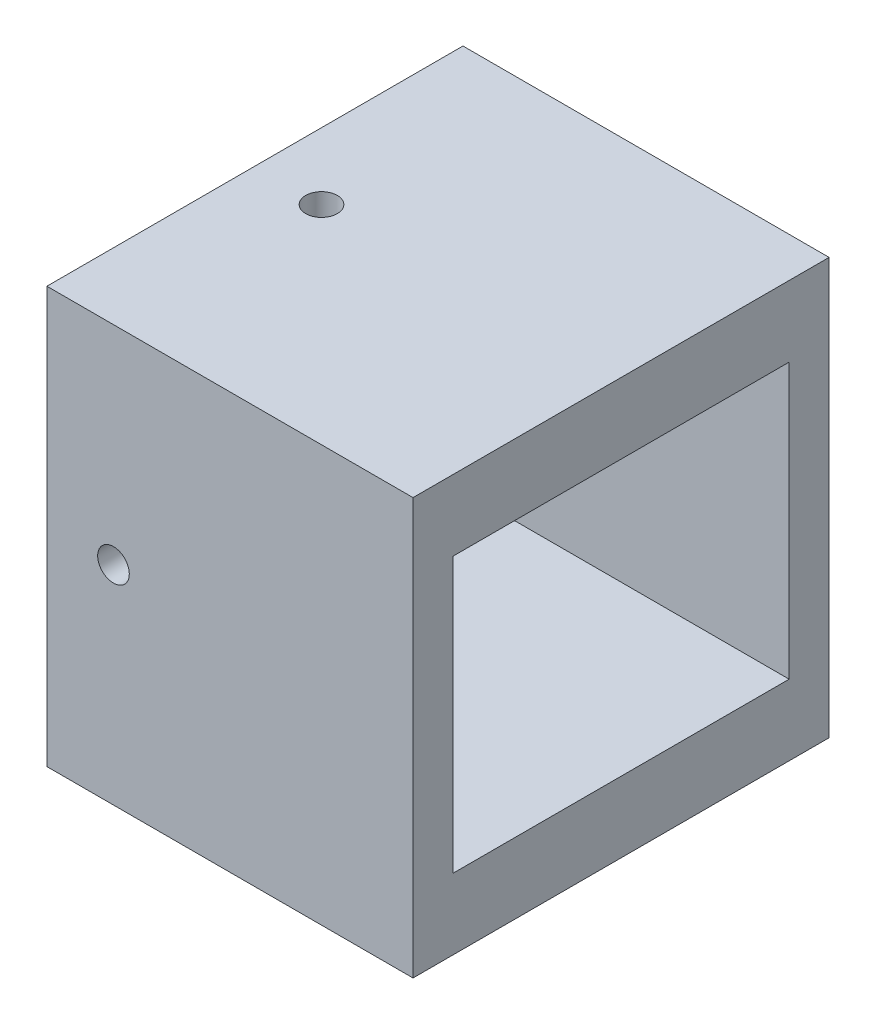
ISO-10303-21;
HEADER;
FILE_DESCRIPTION(('STEP AP214'),'2;1');
FILE_NAME('part.step','',(''),(''),'','','');
FILE_SCHEMA(('AUTOMOTIVE_DESIGN { 1 0 10303 214 1 1 1 1 }'));
ENDSEC;
DATA;
#1=APPLICATION_CONTEXT('core data for automotive mechanical design processes');
#2=APPLICATION_PROTOCOL_DEFINITION('international standard','automotive_design',2000,#1);
#3=PRODUCT_CONTEXT('',#1,'mechanical');
#4=PRODUCT('Part','Part','',(#3));
#5=PRODUCT_RELATED_PRODUCT_CATEGORY('part','',(#4));
#6=PRODUCT_DEFINITION_FORMATION('','',#4);
#7=PRODUCT_DEFINITION_CONTEXT('part definition',#1,'design');
#8=PRODUCT_DEFINITION('design','',#6,#7);
#9=PRODUCT_DEFINITION_SHAPE('','',#8);
#10=(LENGTH_UNIT() NAMED_UNIT(*) SI_UNIT(.MILLI.,.METRE.));
#11=(NAMED_UNIT(*) PLANE_ANGLE_UNIT() SI_UNIT($,.RADIAN.));
#12=(NAMED_UNIT(*) SI_UNIT($,.STERADIAN.) SOLID_ANGLE_UNIT());
#13=UNCERTAINTY_MEASURE_WITH_UNIT(LENGTH_MEASURE(1.E-05),#10,'distance_accuracy_value','');
#14=(GEOMETRIC_REPRESENTATION_CONTEXT(3) GLOBAL_UNCERTAINTY_ASSIGNED_CONTEXT((#13)) GLOBAL_UNIT_ASSIGNED_CONTEXT((#10,
#11,#12)) REPRESENTATION_CONTEXT('',''));
#15=CARTESIAN_POINT('',(0.,0.,0.));
#16=DIRECTION('',(0.,0.,1.));
#17=DIRECTION('',(1.,0.,0.));
#18=AXIS2_PLACEMENT_3D('',#15,#16,#17);
#19=CARTESIAN_POINT('',(20.,0.,0.));
#20=DIRECTION('',(1.,0.,0.));
#21=DIRECTION('',(0.,0.,-1.));
#22=AXIS2_PLACEMENT_3D('',#19,#20,#21);
#23=PLANE('',#22);
#24=DIRECTION('',(0.,1.,0.));
#25=VECTOR('',#24,1.);
#26=CARTESIAN_POINT('',(20.,-12.5,-12.5));
#27=LINE('',#26,#25);
#28=CARTESIAN_POINT('',(20.,-12.5,-12.5));
#29=VERTEX_POINT('',#28);
#30=CARTESIAN_POINT('',(20.,12.5,-12.5));
#31=VERTEX_POINT('',#30);
#32=EDGE_CURVE('E188',#29,#31,#27,.T.);
#33=ORIENTED_EDGE('',*,*,#32,.T.);
#34=DIRECTION('',(0.,0.,1.));
#35=VECTOR('',#34,1.);
#36=CARTESIAN_POINT('',(20.,12.5,-12.5));
#37=LINE('',#36,#35);
#38=CARTESIAN_POINT('',(20.,12.5,12.5));
#39=VERTEX_POINT('',#38);
#40=EDGE_CURVE('E136',#31,#39,#37,.T.);
#41=ORIENTED_EDGE('',*,*,#40,.T.);
#42=DIRECTION('',(0.,1.,0.));
#43=VECTOR('',#42,1.);
#44=CARTESIAN_POINT('',(20.,-12.5,12.5));
#45=LINE('',#44,#43);
#46=CARTESIAN_POINT('',(20.,-12.5,12.5));
#47=VERTEX_POINT('',#46);
#48=EDGE_CURVE('E191',#47,#39,#45,.T.);
#49=ORIENTED_EDGE('',*,*,#48,.F.);
#50=DIRECTION('',(0.,0.,1.));
#51=VECTOR('',#50,1.);
#52=CARTESIAN_POINT('',(20.,-12.5,-12.5));
#53=LINE('',#52,#51);
#54=EDGE_CURVE('E194',#29,#47,#53,.T.);
#55=ORIENTED_EDGE('',*,*,#54,.F.);
#56=EDGE_LOOP('',(#33,#41,#49,#55));
#57=FACE_BOUND('',#56,.T.);
#58=DIRECTION('',(0.,0.,1.));
#59=VECTOR('',#58,1.);
#60=CARTESIAN_POINT('',(20.,8.25,-10.1));
#61=LINE('',#60,#59);
#62=CARTESIAN_POINT('',(20.,8.25,-10.1));
#63=VERTEX_POINT('',#62);
#64=CARTESIAN_POINT('',(20.,8.25,10.1));
#65=VERTEX_POINT('',#64);
#66=EDGE_CURVE('E162',#63,#65,#61,.T.);
#67=ORIENTED_EDGE('',*,*,#66,.F.);
#68=DIRECTION('',(0.,1.,0.));
#69=VECTOR('',#68,1.);
#70=CARTESIAN_POINT('',(20.,-8.25,-10.1));
#71=LINE('',#70,#69);
#72=CARTESIAN_POINT('',(20.,-8.25,-10.1));
#73=VERTEX_POINT('',#72);
#74=EDGE_CURVE('E160',#73,#63,#71,.T.);
#75=ORIENTED_EDGE('',*,*,#74,.F.);
#76=DIRECTION('',(0.,0.,1.));
#77=VECTOR('',#76,1.);
#78=CARTESIAN_POINT('',(20.,-8.25,-10.1));
#79=LINE('',#78,#77);
#80=CARTESIAN_POINT('',(20.,-8.25,10.1));
#81=VERTEX_POINT('',#80);
#82=EDGE_CURVE('E166',#73,#81,#79,.T.);
#83=ORIENTED_EDGE('',*,*,#82,.T.);
#84=DIRECTION('',(0.,1.,0.));
#85=VECTOR('',#84,1.);
#86=CARTESIAN_POINT('',(20.,-8.25,10.1));
#87=LINE('',#86,#85);
#88=EDGE_CURVE('E80',#81,#65,#87,.T.);
#89=ORIENTED_EDGE('',*,*,#88,.T.);
#90=EDGE_LOOP('',(#67,#75,#83,#89));
#91=FACE_BOUND('',#90,.T.);
#92=ADVANCED_FACE('F63',(#57,#91),#23,.T.);
#93=CARTESIAN_POINT('',(20.,-12.5,-12.5));
#94=DIRECTION('',(0.,0.,1.));
#95=DIRECTION('',(1.,0.,0.));
#96=AXIS2_PLACEMENT_3D('',#93,#94,#95);
#97=PLANE('',#96);
#98=CARTESIAN_POINT('',(2.,0.,-12.5));
#99=DIRECTION('',(0.,0.,-1.));
#100=DIRECTION('',(-1.,0.,0.));
#101=AXIS2_PLACEMENT_3D('',#98,#99,#100);
#102=CIRCLE('',#101,0.95);
#103=CARTESIAN_POINT('',(1.05,0.,-12.5));
#104=VERTEX_POINT('',#103);
#105=EDGE_CURVE('E202',#104,#104,#102,.T.);
#106=ORIENTED_EDGE('',*,*,#105,.F.);
#107=EDGE_LOOP('',(#106));
#108=FACE_BOUND('',#107,.T.);
#109=DIRECTION('',(-1.,0.,0.));
#110=VECTOR('',#109,1.);
#111=CARTESIAN_POINT('',(20.,-12.5,-12.5));
#112=LINE('',#111,#110);
#113=CARTESIAN_POINT('',(-2.,-12.5,-12.5));
#114=VERTEX_POINT('',#113);
#115=EDGE_CURVE('E88',#29,#114,#112,.T.);
#116=ORIENTED_EDGE('',*,*,#115,.T.);
#117=DIRECTION('',(0.,1.,0.));
#118=VECTOR('',#117,1.);
#119=CARTESIAN_POINT('',(-2.,-12.5,-12.5));
#120=LINE('',#119,#118);
#121=CARTESIAN_POINT('',(-2.,12.5,-12.5));
#122=VERTEX_POINT('',#121);
#123=EDGE_CURVE('E145',#114,#122,#120,.T.);
#124=ORIENTED_EDGE('',*,*,#123,.T.);
#125=DIRECTION('',(-1.,0.,0.));
#126=VECTOR('',#125,1.);
#127=CARTESIAN_POINT('',(20.,12.5,-12.5));
#128=LINE('',#127,#126);
#129=EDGE_CURVE('E12',#31,#122,#128,.T.);
#130=ORIENTED_EDGE('',*,*,#129,.F.);
#131=ORIENTED_EDGE('',*,*,#32,.F.);
#132=EDGE_LOOP('',(#116,#124,#130,#131));
#133=FACE_BOUND('',#132,.T.);
#134=ADVANCED_FACE('F65',(#108,#133),#97,.F.);
#135=CARTESIAN_POINT('',(20.,12.5,-12.5));
#136=DIRECTION('',(0.,-1.,0.));
#137=DIRECTION('',(0.,0.,-1.));
#138=AXIS2_PLACEMENT_3D('',#135,#136,#137);
#139=PLANE('',#138);
#140=CARTESIAN_POINT('',(2.,12.5,0.));
#141=DIRECTION('',(0.,1.,0.));
#142=DIRECTION('',(0.,0.,1.));
#143=AXIS2_PLACEMENT_3D('',#140,#141,#142);
#144=CIRCLE('',#143,0.95);
#145=CARTESIAN_POINT('',(2.,12.5,0.950000000000002));
#146=VERTEX_POINT('',#145);
#147=EDGE_CURVE('E214',#146,#146,#144,.T.);
#148=ORIENTED_EDGE('',*,*,#147,.F.);
#149=EDGE_LOOP('',(#148));
#150=FACE_BOUND('',#149,.T.);
#151=ORIENTED_EDGE('',*,*,#129,.T.);
#152=DIRECTION('',(0.,0.,1.));
#153=VECTOR('',#152,1.);
#154=CARTESIAN_POINT('',(-2.,12.5,-12.5));
#155=LINE('',#154,#153);
#156=CARTESIAN_POINT('',(-2.,12.5,12.5));
#157=VERTEX_POINT('',#156);
#158=EDGE_CURVE('E135',#122,#157,#155,.T.);
#159=ORIENTED_EDGE('',*,*,#158,.T.);
#160=DIRECTION('',(-1.,0.,0.));
#161=VECTOR('',#160,1.);
#162=CARTESIAN_POINT('',(20.,12.5,12.5));
#163=LINE('',#162,#161);
#164=EDGE_CURVE('E72',#39,#157,#163,.T.);
#165=ORIENTED_EDGE('',*,*,#164,.F.);
#166=ORIENTED_EDGE('',*,*,#40,.F.);
#167=EDGE_LOOP('',(#151,#159,#165,#166));
#168=FACE_BOUND('',#167,.T.);
#169=ADVANCED_FACE('F133',(#150,#168),#139,.F.);
#170=CARTESIAN_POINT('',(20.,-12.5,12.5));
#171=DIRECTION('',(0.,0.,1.));
#172=DIRECTION('',(1.,0.,0.));
#173=AXIS2_PLACEMENT_3D('',#170,#171,#172);
#174=PLANE('',#173);
#175=CARTESIAN_POINT('',(2.,0.,12.5));
#176=DIRECTION('',(0.,0.,1.));
#177=DIRECTION('',(1.,0.,0.));
#178=AXIS2_PLACEMENT_3D('',#175,#176,#177);
#179=CIRCLE('',#178,0.95);
#180=CARTESIAN_POINT('',(2.95,0.,12.5));
#181=VERTEX_POINT('',#180);
#182=EDGE_CURVE('E282',#181,#181,#179,.T.);
#183=ORIENTED_EDGE('',*,*,#182,.F.);
#184=EDGE_LOOP('',(#183));
#185=FACE_BOUND('',#184,.T.);
#186=ORIENTED_EDGE('',*,*,#164,.T.);
#187=DIRECTION('',(0.,1.,0.));
#188=VECTOR('',#187,1.);
#189=CARTESIAN_POINT('',(-2.,-12.5,12.5));
#190=LINE('',#189,#188);
#191=CARTESIAN_POINT('',(-2.,-12.5,12.5));
#192=VERTEX_POINT('',#191);
#193=EDGE_CURVE('E147',#192,#157,#190,.T.);
#194=ORIENTED_EDGE('',*,*,#193,.F.);
#195=DIRECTION('',(-1.,0.,0.));
#196=VECTOR('',#195,1.);
#197=CARTESIAN_POINT('',(20.,-12.5,12.5));
#198=LINE('',#197,#196);
#199=EDGE_CURVE('E197',#47,#192,#198,.T.);
#200=ORIENTED_EDGE('',*,*,#199,.F.);
#201=ORIENTED_EDGE('',*,*,#48,.T.);
#202=EDGE_LOOP('',(#186,#194,#200,#201));
#203=FACE_BOUND('',#202,.T.);
#204=ADVANCED_FACE('F270',(#185,#203),#174,.T.);
#205=CARTESIAN_POINT('',(20.,-12.5,-12.5));
#206=DIRECTION('',(0.,-1.,0.));
#207=DIRECTION('',(0.,0.,-1.));
#208=AXIS2_PLACEMENT_3D('',#205,#206,#207);
#209=PLANE('',#208);
#210=CARTESIAN_POINT('',(2.,-12.5,0.));
#211=DIRECTION('',(0.,-1.,0.));
#212=DIRECTION('',(0.,0.,-1.));
#213=AXIS2_PLACEMENT_3D('',#210,#211,#212);
#214=CIRCLE('',#213,0.95);
#215=CARTESIAN_POINT('',(2.,-12.5,-0.950000000000002));
#216=VERTEX_POINT('',#215);
#217=EDGE_CURVE('E201',#216,#216,#214,.T.);
#218=ORIENTED_EDGE('',*,*,#217,.F.);
#219=EDGE_LOOP('',(#218));
#220=FACE_BOUND('',#219,.T.);
#221=ORIENTED_EDGE('',*,*,#199,.T.);
#222=DIRECTION('',(0.,0.,1.));
#223=VECTOR('',#222,1.);
#224=CARTESIAN_POINT('',(-2.,-12.5,-12.5));
#225=LINE('',#224,#223);
#226=EDGE_CURVE('E157',#114,#192,#225,.T.);
#227=ORIENTED_EDGE('',*,*,#226,.F.);
#228=ORIENTED_EDGE('',*,*,#115,.F.);
#229=ORIENTED_EDGE('',*,*,#54,.T.);
#230=EDGE_LOOP('',(#221,#227,#228,#229));
#231=FACE_BOUND('',#230,.T.);
#232=ADVANCED_FACE('F267',(#220,#231),#209,.T.);
#233=CARTESIAN_POINT('',(20.,-8.25,-10.1));
#234=DIRECTION('',(0.,0.,1.));
#235=DIRECTION('',(1.,0.,0.));
#236=AXIS2_PLACEMENT_3D('',#233,#234,#235);
#237=PLANE('',#236);
#238=CARTESIAN_POINT('',(2.,0.,-10.1));
#239=DIRECTION('',(0.,0.,1.));
#240=DIRECTION('',(1.,0.,0.));
#241=AXIS2_PLACEMENT_3D('',#238,#239,#240);
#242=CIRCLE('',#241,0.95);
#243=CARTESIAN_POINT('',(2.95,0.,-10.1));
#244=VERTEX_POINT('',#243);
#245=EDGE_CURVE('E199',#244,#244,#242,.T.);
#246=ORIENTED_EDGE('',*,*,#245,.F.);
#247=EDGE_LOOP('',(#246));
#248=FACE_BOUND('',#247,.T.);
#249=DIRECTION('',(0.,1.,0.));
#250=VECTOR('',#249,1.);
#251=CARTESIAN_POINT('',(0.,-8.25,-10.1));
#252=LINE('',#251,#250);
#253=CARTESIAN_POINT('',(0.,-8.25,-10.1));
#254=VERTEX_POINT('',#253);
#255=CARTESIAN_POINT('',(0.,8.25,-10.1));
#256=VERTEX_POINT('',#255);
#257=EDGE_CURVE('E159',#254,#256,#252,.T.);
#258=ORIENTED_EDGE('',*,*,#257,.F.);
#259=DIRECTION('',(-1.,0.,0.));
#260=VECTOR('',#259,1.);
#261=CARTESIAN_POINT('',(20.,-8.25,-10.1));
#262=LINE('',#261,#260);
#263=EDGE_CURVE('E169',#73,#254,#262,.T.);
#264=ORIENTED_EDGE('',*,*,#263,.F.);
#265=ORIENTED_EDGE('',*,*,#74,.T.);
#266=DIRECTION('',(-1.,0.,0.));
#267=VECTOR('',#266,1.);
#268=CARTESIAN_POINT('',(20.,8.25,-10.1));
#269=LINE('',#268,#267);
#270=EDGE_CURVE('E185',#63,#256,#269,.T.);
#271=ORIENTED_EDGE('',*,*,#270,.T.);
#272=EDGE_LOOP('',(#258,#264,#265,#271));
#273=FACE_BOUND('',#272,.T.);
#274=ADVANCED_FACE('F236',(#248,#273),#237,.T.);
#275=CARTESIAN_POINT('',(20.,8.25,-10.1));
#276=DIRECTION('',(0.,-1.,0.));
#277=DIRECTION('',(0.,0.,-1.));
#278=AXIS2_PLACEMENT_3D('',#275,#276,#277);
#279=PLANE('',#278);
#280=DIRECTION('',(0.,0.,1.));
#281=VECTOR('',#280,1.);
#282=CARTESIAN_POINT('',(0.,8.25,-10.1));
#283=LINE('',#282,#281);
#284=CARTESIAN_POINT('',(0.,8.25,10.1));
#285=VERTEX_POINT('',#284);
#286=EDGE_CURVE('E171',#256,#285,#283,.T.);
#287=ORIENTED_EDGE('',*,*,#286,.F.);
#288=ORIENTED_EDGE('',*,*,#270,.F.);
#289=ORIENTED_EDGE('',*,*,#66,.T.);
#290=DIRECTION('',(-1.,0.,0.));
#291=VECTOR('',#290,1.);
#292=CARTESIAN_POINT('',(20.,8.25,10.1));
#293=LINE('',#292,#291);
#294=EDGE_CURVE('E182',#65,#285,#293,.T.);
#295=ORIENTED_EDGE('',*,*,#294,.T.);
#296=EDGE_LOOP('',(#287,#288,#289,#295));
#297=FACE_BOUND('',#296,.T.);
#298=ADVANCED_FACE('F243',(#297),#279,.T.);
#299=CARTESIAN_POINT('',(20.,-8.25,10.1));
#300=DIRECTION('',(0.,0.,1.));
#301=DIRECTION('',(0.,-1.,0.));
#302=AXIS2_PLACEMENT_3D('',#299,#300,#301);
#303=PLANE('',#302);
#304=CARTESIAN_POINT('',(2.,0.,10.1));
#305=DIRECTION('',(0.,0.,1.));
#306=DIRECTION('',(0.,-1.,0.));
#307=AXIS2_PLACEMENT_3D('',#304,#305,#306);
#308=CIRCLE('',#307,0.95);
#309=CARTESIAN_POINT('',(2.,-0.95,10.1));
#310=VERTEX_POINT('',#309);
#311=EDGE_CURVE('E67',#310,#310,#308,.T.);
#312=ORIENTED_EDGE('',*,*,#311,.T.);
#313=EDGE_LOOP('',(#312));
#314=FACE_BOUND('',#313,.T.);
#315=DIRECTION('',(0.,1.,0.));
#316=VECTOR('',#315,1.);
#317=CARTESIAN_POINT('',(0.,-8.25,10.1));
#318=LINE('',#317,#316);
#319=CARTESIAN_POINT('',(0.,-8.25,10.1));
#320=VERTEX_POINT('',#319);
#321=EDGE_CURVE('E173',#320,#285,#318,.T.);
#322=ORIENTED_EDGE('',*,*,#321,.T.);
#323=ORIENTED_EDGE('',*,*,#294,.F.);
#324=ORIENTED_EDGE('',*,*,#88,.F.);
#325=DIRECTION('',(-1.,0.,0.));
#326=VECTOR('',#325,1.);
#327=CARTESIAN_POINT('',(20.,-8.25,10.1));
#328=LINE('',#327,#326);
#329=EDGE_CURVE('E180',#81,#320,#328,.T.);
#330=ORIENTED_EDGE('',*,*,#329,.T.);
#331=EDGE_LOOP('',(#322,#323,#324,#330));
#332=FACE_BOUND('',#331,.T.);
#333=ADVANCED_FACE('F244',(#314,#332),#303,.F.);
#334=CARTESIAN_POINT('',(20.,-8.25,-10.1));
#335=DIRECTION('',(0.,-1.,0.));
#336=DIRECTION('',(0.,0.,-1.));
#337=AXIS2_PLACEMENT_3D('',#334,#335,#336);
#338=PLANE('',#337);
#339=DIRECTION('',(0.,0.,1.));
#340=VECTOR('',#339,1.);
#341=CARTESIAN_POINT('',(0.,-8.25,-10.1));
#342=LINE('',#341,#340);
#343=EDGE_CURVE('E163',#254,#320,#342,.T.);
#344=ORIENTED_EDGE('',*,*,#343,.T.);
#345=ORIENTED_EDGE('',*,*,#329,.F.);
#346=ORIENTED_EDGE('',*,*,#82,.F.);
#347=ORIENTED_EDGE('',*,*,#263,.T.);
#348=EDGE_LOOP('',(#344,#345,#346,#347));
#349=FACE_BOUND('',#348,.T.);
#350=ADVANCED_FACE('F229',(#349),#338,.F.);
#351=CARTESIAN_POINT('',(0.,0.,0.));
#352=DIRECTION('',(1.,0.,0.));
#353=DIRECTION('',(0.,0.,-1.));
#354=AXIS2_PLACEMENT_3D('',#351,#352,#353);
#355=PLANE('',#354);
#356=CARTESIAN_POINT('',(0.,0.,-6.1));
#357=DIRECTION('',(1.,0.,0.));
#358=DIRECTION('',(0.,0.,-1.));
#359=AXIS2_PLACEMENT_3D('',#356,#357,#358);
#360=CIRCLE('',#359,0.749999999999999);
#361=CARTESIAN_POINT('',(0.,0.,-6.85));
#362=VERTEX_POINT('',#361);
#363=EDGE_CURVE('E285',#362,#362,#360,.F.);
#364=ORIENTED_EDGE('',*,*,#363,.T.);
#365=EDGE_LOOP('',(#364));
#366=FACE_BOUND('',#365,.T.);
#367=CARTESIAN_POINT('',(0.,0.,6.1));
#368=DIRECTION('',(1.,0.,0.));
#369=DIRECTION('',(0.,0.,-1.));
#370=AXIS2_PLACEMENT_3D('',#367,#368,#369);
#371=CIRCLE('',#370,0.749999999999999);
#372=CARTESIAN_POINT('',(0.,0.,5.35));
#373=VERTEX_POINT('',#372);
#374=EDGE_CURVE('E293',#373,#373,#371,.F.);
#375=ORIENTED_EDGE('',*,*,#374,.T.);
#376=EDGE_LOOP('',(#375));
#377=FACE_BOUND('',#376,.T.);
#378=CARTESIAN_POINT('',(0.,0.,0.));
#379=DIRECTION('',(1.,0.,0.));
#380=DIRECTION('',(0.,0.,-1.));
#381=AXIS2_PLACEMENT_3D('',#378,#379,#380);
#382=CIRCLE('',#381,0.5);
#383=CARTESIAN_POINT('',(0.,0.,-0.5));
#384=VERTEX_POINT('',#383);
#385=EDGE_CURVE('E152',#384,#384,#382,.T.);
#386=ORIENTED_EDGE('',*,*,#385,.F.);
#387=EDGE_LOOP('',(#386));
#388=FACE_BOUND('',#387,.T.);
#389=ORIENTED_EDGE('',*,*,#343,.F.);
#390=ORIENTED_EDGE('',*,*,#257,.T.);
#391=ORIENTED_EDGE('',*,*,#286,.T.);
#392=ORIENTED_EDGE('',*,*,#321,.F.);
#393=EDGE_LOOP('',(#389,#390,#391,#392));
#394=FACE_BOUND('',#393,.T.);
#395=ADVANCED_FACE('F226',(#366,#377,#388,#394),#355,.T.);
#396=CARTESIAN_POINT('',(-2.,0.,0.));
#397=DIRECTION('',(1.,0.,0.));
#398=DIRECTION('',(0.,0.,-1.));
#399=AXIS2_PLACEMENT_3D('',#396,#397,#398);
#400=PLANE('',#399);
#401=CARTESIAN_POINT('',(-2.,0.,-6.1));
#402=DIRECTION('',(-1.,0.,0.));
#403=DIRECTION('',(0.,0.,1.));
#404=AXIS2_PLACEMENT_3D('',#401,#402,#403);
#405=CIRCLE('',#404,0.749999999999999);
#406=CARTESIAN_POINT('',(-2.,0.,-5.35));
#407=VERTEX_POINT('',#406);
#408=EDGE_CURVE('E290',#407,#407,#405,.T.);
#409=ORIENTED_EDGE('',*,*,#408,.F.);
#410=EDGE_LOOP('',(#409));
#411=FACE_BOUND('',#410,.T.);
#412=CARTESIAN_POINT('',(-2.,0.,6.1));
#413=DIRECTION('',(-1.,0.,0.));
#414=DIRECTION('',(0.,0.,1.));
#415=AXIS2_PLACEMENT_3D('',#412,#413,#414);
#416=CIRCLE('',#415,0.749999999999999);
#417=CARTESIAN_POINT('',(-2.,0.,6.85));
#418=VERTEX_POINT('',#417);
#419=EDGE_CURVE('E296',#418,#418,#416,.T.);
#420=ORIENTED_EDGE('',*,*,#419,.F.);
#421=EDGE_LOOP('',(#420));
#422=FACE_BOUND('',#421,.T.);
#423=ORIENTED_EDGE('',*,*,#123,.F.);
#424=ORIENTED_EDGE('',*,*,#226,.T.);
#425=ORIENTED_EDGE('',*,*,#193,.T.);
#426=ORIENTED_EDGE('',*,*,#158,.F.);
#427=EDGE_LOOP('',(#423,#424,#425,#426));
#428=FACE_BOUND('',#427,.T.);
#429=ADVANCED_FACE('F143',(#411,#422,#428),#400,.F.);
#430=CARTESIAN_POINT('',(-0.1,0.,0.));
#431=DIRECTION('',(1.,0.,0.));
#432=DIRECTION('',(0.,0.,-1.));
#433=AXIS2_PLACEMENT_3D('',#430,#431,#432);
#434=CYLINDRICAL_SURFACE('',#433,0.5);
#435=CARTESIAN_POINT('',(-0.1,0.,0.));
#436=DIRECTION('',(1.,0.,0.));
#437=DIRECTION('',(0.,0.,-1.));
#438=AXIS2_PLACEMENT_3D('',#435,#436,#437);
#439=CIRCLE('',#438,0.5);
#440=CARTESIAN_POINT('',(-0.1,0.,-0.5));
#441=VERTEX_POINT('',#440);
#442=EDGE_CURVE('E149',#441,#441,#439,.T.);
#443=ORIENTED_EDGE('',*,*,#442,.F.);
#444=EDGE_LOOP('',(#443));
#445=FACE_BOUND('',#444,.T.);
#446=ORIENTED_EDGE('',*,*,#385,.T.);
#447=EDGE_LOOP('',(#446));
#448=FACE_BOUND('',#447,.T.);
#449=ADVANCED_FACE('F224',(#445,#448),#434,.F.);
#450=CARTESIAN_POINT('',(-0.1,0.,0.));
#451=DIRECTION('',(1.,0.,0.));
#452=DIRECTION('',(0.,0.,-1.));
#453=AXIS2_PLACEMENT_3D('',#450,#451,#452);
#454=PLANE('',#453);
#455=ORIENTED_EDGE('',*,*,#442,.T.);
#456=EDGE_LOOP('',(#455));
#457=FACE_BOUND('',#456,.T.);
#458=ADVANCED_FACE('F341',(#457),#454,.T.);
#459=CARTESIAN_POINT('',(2.,-8.5,0.));
#460=DIRECTION('',(0.,-1.,0.));
#461=DIRECTION('',(0.,0.,-1.));
#462=AXIS2_PLACEMENT_3D('',#459,#460,#461);
#463=CYLINDRICAL_SURFACE('',#462,0.95);
#464=CARTESIAN_POINT('',(2.,-8.5,0.));
#465=DIRECTION('',(0.,-1.,0.));
#466=DIRECTION('',(0.,0.,-1.));
#467=AXIS2_PLACEMENT_3D('',#464,#465,#466);
#468=CIRCLE('',#467,0.95);
#469=CARTESIAN_POINT('',(2.,-8.5,-0.950000000000001));
#470=VERTEX_POINT('',#469);
#471=EDGE_CURVE('E206',#470,#470,#468,.T.);
#472=ORIENTED_EDGE('',*,*,#471,.F.);
#473=EDGE_LOOP('',(#472));
#474=FACE_BOUND('',#473,.T.);
#475=ORIENTED_EDGE('',*,*,#217,.T.);
#476=EDGE_LOOP('',(#475));
#477=FACE_BOUND('',#476,.T.);
#478=ADVANCED_FACE('F338',(#474,#477),#463,.F.);
#479=CARTESIAN_POINT('',(2.,-8.5,0.));
#480=DIRECTION('',(0.,-1.,0.));
#481=DIRECTION('',(0.,0.,-1.));
#482=AXIS2_PLACEMENT_3D('',#479,#480,#481);
#483=PLANE('',#482);
#484=ORIENTED_EDGE('',*,*,#471,.T.);
#485=EDGE_LOOP('',(#484));
#486=FACE_BOUND('',#485,.T.);
#487=ADVANCED_FACE('F335',(#486),#483,.T.);
#488=CARTESIAN_POINT('',(2.,0.,-8.5));
#489=DIRECTION('',(0.,0.,-1.));
#490=DIRECTION('',(-1.,0.,0.));
#491=AXIS2_PLACEMENT_3D('',#488,#489,#490);
#492=CYLINDRICAL_SURFACE('',#491,0.95);
#493=ORIENTED_EDGE('',*,*,#245,.T.);
#494=EDGE_LOOP('',(#493));
#495=FACE_BOUND('',#494,.T.);
#496=ORIENTED_EDGE('',*,*,#105,.T.);
#497=EDGE_LOOP('',(#496));
#498=FACE_BOUND('',#497,.T.);
#499=ADVANCED_FACE('F331',(#495,#498),#492,.F.);
#500=CARTESIAN_POINT('',(2.,8.5,0.));
#501=DIRECTION('',(0.,1.,0.));
#502=DIRECTION('',(0.,0.,1.));
#503=AXIS2_PLACEMENT_3D('',#500,#501,#502);
#504=CYLINDRICAL_SURFACE('',#503,0.95);
#505=CARTESIAN_POINT('',(2.,8.5,0.));
#506=DIRECTION('',(0.,1.,0.));
#507=DIRECTION('',(0.,0.,1.));
#508=AXIS2_PLACEMENT_3D('',#505,#506,#507);
#509=CIRCLE('',#508,0.95);
#510=CARTESIAN_POINT('',(2.,8.5,0.950000000000001));
#511=VERTEX_POINT('',#510);
#512=EDGE_CURVE('E209',#511,#511,#509,.T.);
#513=ORIENTED_EDGE('',*,*,#512,.F.);
#514=EDGE_LOOP('',(#513));
#515=FACE_BOUND('',#514,.T.);
#516=ORIENTED_EDGE('',*,*,#147,.T.);
#517=EDGE_LOOP('',(#516));
#518=FACE_BOUND('',#517,.T.);
#519=ADVANCED_FACE('F327',(#515,#518),#504,.F.);
#520=CARTESIAN_POINT('',(2.,8.5,0.));
#521=DIRECTION('',(0.,1.,0.));
#522=DIRECTION('',(0.,0.,1.));
#523=AXIS2_PLACEMENT_3D('',#520,#521,#522);
#524=PLANE('',#523);
#525=ORIENTED_EDGE('',*,*,#512,.T.);
#526=EDGE_LOOP('',(#525));
#527=FACE_BOUND('',#526,.T.);
#528=ADVANCED_FACE('F322',(#527),#524,.T.);
#529=CARTESIAN_POINT('',(2.,0.,8.5));
#530=DIRECTION('',(0.,0.,1.));
#531=DIRECTION('',(1.,0.,0.));
#532=AXIS2_PLACEMENT_3D('',#529,#530,#531);
#533=CYLINDRICAL_SURFACE('',#532,0.95);
#534=ORIENTED_EDGE('',*,*,#182,.T.);
#535=EDGE_LOOP('',(#534));
#536=FACE_BOUND('',#535,.T.);
#537=ORIENTED_EDGE('',*,*,#311,.F.);
#538=EDGE_LOOP('',(#537));
#539=FACE_BOUND('',#538,.T.);
#540=ADVANCED_FACE('F313',(#536,#539),#533,.F.);
#541=CARTESIAN_POINT('',(2.12132034355964,0.,6.1));
#542=DIRECTION('',(-1.,0.,0.));
#543=DIRECTION('',(0.,0.,1.));
#544=AXIS2_PLACEMENT_3D('',#541,#542,#543);
#545=CYLINDRICAL_SURFACE('',#544,0.749999999999999);
#546=ORIENTED_EDGE('',*,*,#419,.T.);
#547=EDGE_LOOP('',(#546));
#548=FACE_BOUND('',#547,.T.);
#549=ORIENTED_EDGE('',*,*,#374,.F.);
#550=EDGE_LOOP('',(#549));
#551=FACE_BOUND('',#550,.T.);
#552=ADVANCED_FACE('F310',(#548,#551),#545,.F.);
#553=CARTESIAN_POINT('',(2.12132034355964,0.,-6.1));
#554=DIRECTION('',(-1.,0.,0.));
#555=DIRECTION('',(0.,0.,1.));
#556=AXIS2_PLACEMENT_3D('',#553,#554,#555);
#557=CYLINDRICAL_SURFACE('',#556,0.749999999999999);
#558=ORIENTED_EDGE('',*,*,#408,.T.);
#559=EDGE_LOOP('',(#558));
#560=FACE_BOUND('',#559,.T.);
#561=ORIENTED_EDGE('',*,*,#363,.F.);
#562=EDGE_LOOP('',(#561));
#563=FACE_BOUND('',#562,.T.);
#564=ADVANCED_FACE('F302',(#560,#563),#557,.F.);
#565=CLOSED_SHELL('',(#92,#134,#169,#204,#232,#274,#298,#333,#350,#395,#429,#449,#458,#478,#487,
#499,#519,#528,#540,#552,#564));
#566=MANIFOLD_SOLID_BREP('B2',#565);
#567=ADVANCED_BREP_SHAPE_REPRESENTATION('',(#18,#566),#14);
#568=SHAPE_DEFINITION_REPRESENTATION(#9,#567);
ENDSEC;
END-ISO-10303-21;
